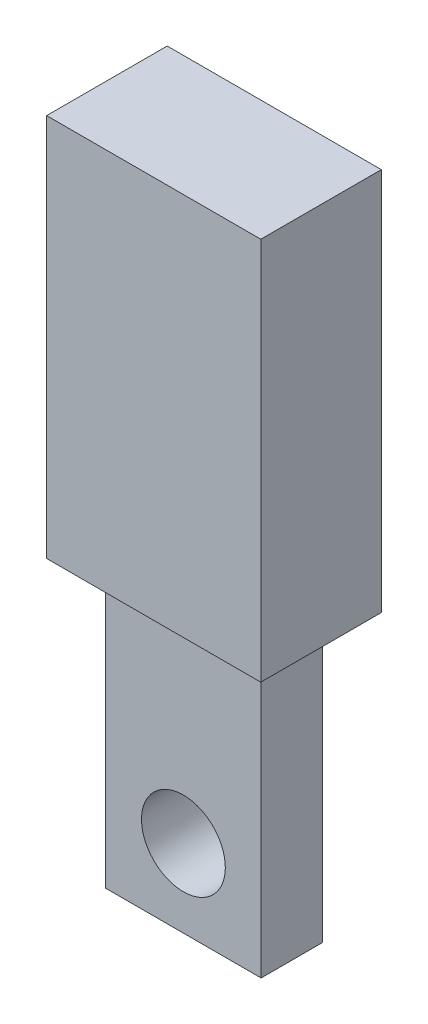
ISO-10303-21;
HEADER;
FILE_DESCRIPTION(('STEP AP214'),'2;1');
FILE_NAME('part.step','',(''),(''),'','','');
FILE_SCHEMA(('AUTOMOTIVE_DESIGN { 1 0 10303 214 1 1 1 1 }'));
ENDSEC;
DATA;
#1=APPLICATION_CONTEXT('core data for automotive mechanical design processes');
#2=APPLICATION_PROTOCOL_DEFINITION('international standard','automotive_design',2000,#1);
#3=PRODUCT_CONTEXT('',#1,'mechanical');
#4=PRODUCT('Part','Part','',(#3));
#5=PRODUCT_RELATED_PRODUCT_CATEGORY('part','',(#4));
#6=PRODUCT_DEFINITION_FORMATION('','',#4);
#7=PRODUCT_DEFINITION_CONTEXT('part definition',#1,'design');
#8=PRODUCT_DEFINITION('design','',#6,#7);
#9=PRODUCT_DEFINITION_SHAPE('','',#8);
#10=(LENGTH_UNIT() NAMED_UNIT(*) SI_UNIT(.MILLI.,.METRE.));
#11=(NAMED_UNIT(*) PLANE_ANGLE_UNIT() SI_UNIT($,.RADIAN.));
#12=(NAMED_UNIT(*) SI_UNIT($,.STERADIAN.) SOLID_ANGLE_UNIT());
#13=UNCERTAINTY_MEASURE_WITH_UNIT(LENGTH_MEASURE(1.E-05),#10,'distance_accuracy_value','');
#14=(GEOMETRIC_REPRESENTATION_CONTEXT(3) GLOBAL_UNCERTAINTY_ASSIGNED_CONTEXT((#13)) GLOBAL_UNIT_ASSIGNED_CONTEXT((#10,
#11,#12)) REPRESENTATION_CONTEXT('',''));
#15=CARTESIAN_POINT('',(0.,0.,0.));
#16=DIRECTION('',(0.,0.,1.));
#17=DIRECTION('',(1.,0.,0.));
#18=AXIS2_PLACEMENT_3D('',#15,#16,#17);
#19=CARTESIAN_POINT('',(-32.258,-59.309,-12.7));
#20=DIRECTION('',(-1.,0.,0.));
#21=DIRECTION('',(0.,0.,1.));
#22=AXIS2_PLACEMENT_3D('',#19,#20,#21);
#23=PLANE('',#22);
#24=DIRECTION('',(0.,1.,0.));
#25=VECTOR('',#24,1.);
#26=CARTESIAN_POINT('',(-32.258,-59.309,12.7));
#27=LINE('',#26,#25);
#28=CARTESIAN_POINT('',(-32.258,-59.309,12.7));
#29=VERTEX_POINT('',#28);
#30=CARTESIAN_POINT('',(-32.258,59.309,12.7));
#31=VERTEX_POINT('',#30);
#32=EDGE_CURVE('E33',#29,#31,#27,.T.);
#33=ORIENTED_EDGE('',*,*,#32,.T.);
#34=DIRECTION('',(0.,0.,1.));
#35=VECTOR('',#34,1.);
#36=CARTESIAN_POINT('',(-32.258,59.309,-12.7));
#37=LINE('',#36,#35);
#38=CARTESIAN_POINT('',(-32.258,59.309,-12.7));
#39=VERTEX_POINT('',#38);
#40=EDGE_CURVE('E131',#39,#31,#37,.T.);
#41=ORIENTED_EDGE('',*,*,#40,.F.);
#42=DIRECTION('',(0.,1.,0.));
#43=VECTOR('',#42,1.);
#44=CARTESIAN_POINT('',(-32.258,-59.309,-12.7));
#45=LINE('',#44,#43);
#46=CARTESIAN_POINT('',(-32.258,-59.309,-12.7));
#47=VERTEX_POINT('',#46);
#48=EDGE_CURVE('E11',#47,#39,#45,.T.);
#49=ORIENTED_EDGE('',*,*,#48,.F.);
#50=DIRECTION('',(0.,0.,1.));
#51=VECTOR('',#50,1.);
#52=CARTESIAN_POINT('',(-32.258,-59.309,-12.7));
#53=LINE('',#52,#51);
#54=EDGE_CURVE('E143',#47,#29,#53,.T.);
#55=ORIENTED_EDGE('',*,*,#54,.T.);
#56=EDGE_LOOP('',(#33,#41,#49,#55));
#57=FACE_BOUND('',#56,.T.);
#58=ADVANCED_FACE('F30',(#57),#23,.T.);
#59=CARTESIAN_POINT('',(-32.258,-59.309,-12.7));
#60=DIRECTION('',(0.,0.,-1.));
#61=DIRECTION('',(-1.,0.,0.));
#62=AXIS2_PLACEMENT_3D('',#59,#60,#61);
#63=PLANE('',#62);
#64=CARTESIAN_POINT('',(0.,-27.051,-12.7));
#65=DIRECTION('',(0.,0.,1.));
#66=DIRECTION('',(1.,0.,0.));
#67=AXIS2_PLACEMENT_3D('',#64,#65,#66);
#68=CIRCLE('',#67,17.399);
#69=CARTESIAN_POINT('',(17.399,-27.051,-12.7));
#70=VERTEX_POINT('',#69);
#71=EDGE_CURVE('E123',#70,#70,#68,.T.);
#72=ORIENTED_EDGE('',*,*,#71,.T.);
#73=EDGE_LOOP('',(#72));
#74=FACE_BOUND('',#73,.T.);
#75=ORIENTED_EDGE('',*,*,#48,.T.);
#76=DIRECTION('',(-1.,0.,0.));
#77=VECTOR('',#76,1.);
#78=CARTESIAN_POINT('',(-32.258,59.309,-12.7));
#79=LINE('',#78,#77);
#80=CARTESIAN_POINT('',(32.258,59.309,-12.7));
#81=VERTEX_POINT('',#80);
#82=EDGE_CURVE('E140',#81,#39,#79,.T.);
#83=ORIENTED_EDGE('',*,*,#82,.F.);
#84=DIRECTION('',(0.,1.,0.));
#85=VECTOR('',#84,1.);
#86=CARTESIAN_POINT('',(32.258,-59.309,-12.7));
#87=LINE('',#86,#85);
#88=CARTESIAN_POINT('',(32.258,-59.309,-12.7));
#89=VERTEX_POINT('',#88);
#90=EDGE_CURVE('E38',#89,#81,#87,.T.);
#91=ORIENTED_EDGE('',*,*,#90,.F.);
#92=DIRECTION('',(-1.,0.,0.));
#93=VECTOR('',#92,1.);
#94=CARTESIAN_POINT('',(-32.258,-59.309,-12.7));
#95=LINE('',#94,#93);
#96=EDGE_CURVE('E150',#89,#47,#95,.T.);
#97=ORIENTED_EDGE('',*,*,#96,.T.);
#98=EDGE_LOOP('',(#75,#83,#91,#97));
#99=FACE_BOUND('',#98,.T.);
#100=ADVANCED_FACE('F161',(#74,#99),#63,.T.);
#101=CARTESIAN_POINT('',(32.258,-59.309,-12.7));
#102=DIRECTION('',(1.,0.,0.));
#103=DIRECTION('',(0.,0.,-1.));
#104=AXIS2_PLACEMENT_3D('',#101,#102,#103);
#105=PLANE('',#104);
#106=ORIENTED_EDGE('',*,*,#90,.T.);
#107=DIRECTION('',(0.,0.,-1.));
#108=VECTOR('',#107,1.);
#109=CARTESIAN_POINT('',(32.258,59.309,-12.7));
#110=LINE('',#109,#108);
#111=CARTESIAN_POINT('',(32.258,59.309,12.7));
#112=VERTEX_POINT('',#111);
#113=EDGE_CURVE('E137',#112,#81,#110,.T.);
#114=ORIENTED_EDGE('',*,*,#113,.F.);
#115=DIRECTION('',(0.,1.,0.));
#116=VECTOR('',#115,1.);
#117=CARTESIAN_POINT('',(32.258,-59.309,12.7));
#118=LINE('',#117,#116);
#119=CARTESIAN_POINT('',(32.258,-59.309,12.7));
#120=VERTEX_POINT('',#119);
#121=EDGE_CURVE('E152',#120,#112,#118,.T.);
#122=ORIENTED_EDGE('',*,*,#121,.F.);
#123=DIRECTION('',(0.,0.,-1.));
#124=VECTOR('',#123,1.);
#125=CARTESIAN_POINT('',(32.258,-59.309,-12.7));
#126=LINE('',#125,#124);
#127=EDGE_CURVE('E148',#120,#89,#126,.T.);
#128=ORIENTED_EDGE('',*,*,#127,.T.);
#129=EDGE_LOOP('',(#106,#114,#122,#128));
#130=FACE_BOUND('',#129,.T.);
#131=ADVANCED_FACE('F167',(#130),#105,.T.);
#132=CARTESIAN_POINT('',(-32.258,-59.309,12.7));
#133=DIRECTION('',(0.,0.,1.));
#134=DIRECTION('',(1.,0.,0.));
#135=AXIS2_PLACEMENT_3D('',#132,#133,#134);
#136=PLANE('',#135);
#137=CARTESIAN_POINT('',(0.,-27.051,12.7));
#138=DIRECTION('',(0.,0.,1.));
#139=DIRECTION('',(1.,0.,0.));
#140=AXIS2_PLACEMENT_3D('',#137,#138,#139);
#141=CIRCLE('',#140,17.399);
#142=CARTESIAN_POINT('',(17.399,-27.051,12.7));
#143=VERTEX_POINT('',#142);
#144=EDGE_CURVE('E120',#143,#143,#141,.T.);
#145=ORIENTED_EDGE('',*,*,#144,.F.);
#146=EDGE_LOOP('',(#145));
#147=FACE_BOUND('',#146,.T.);
#148=ORIENTED_EDGE('',*,*,#121,.T.);
#149=DIRECTION('',(1.,0.,0.));
#150=VECTOR('',#149,1.);
#151=CARTESIAN_POINT('',(-32.258,59.309,12.7));
#152=LINE('',#151,#150);
#153=EDGE_CURVE('E134',#31,#112,#152,.T.);
#154=ORIENTED_EDGE('',*,*,#153,.F.);
#155=ORIENTED_EDGE('',*,*,#32,.F.);
#156=DIRECTION('',(1.,0.,0.));
#157=VECTOR('',#156,1.);
#158=CARTESIAN_POINT('',(-32.258,-59.309,12.7));
#159=LINE('',#158,#157);
#160=EDGE_CURVE('E145',#29,#120,#159,.T.);
#161=ORIENTED_EDGE('',*,*,#160,.T.);
#162=EDGE_LOOP('',(#148,#154,#155,#161));
#163=FACE_BOUND('',#162,.T.);
#164=ADVANCED_FACE('F157',(#147,#163),#136,.T.);
#165=CARTESIAN_POINT('',(-32.258,-59.309,12.7));
#166=DIRECTION('',(0.,1.,0.));
#167=DIRECTION('',(0.,0.,1.));
#168=AXIS2_PLACEMENT_3D('',#165,#166,#167);
#169=PLANE('',#168);
#170=ORIENTED_EDGE('',*,*,#54,.F.);
#171=ORIENTED_EDGE('',*,*,#96,.F.);
#172=ORIENTED_EDGE('',*,*,#127,.F.);
#173=ORIENTED_EDGE('',*,*,#160,.F.);
#174=EDGE_LOOP('',(#170,#171,#172,#173));
#175=FACE_BOUND('',#174,.T.);
#176=ADVANCED_FACE('F165',(#175),#169,.F.);
#177=CARTESIAN_POINT('',(0.,-27.051,-12.7));
#178=DIRECTION('',(0.,0.,1.));
#179=DIRECTION('',(1.,0.,0.));
#180=AXIS2_PLACEMENT_3D('',#177,#178,#179);
#181=CYLINDRICAL_SURFACE('',#180,17.399);
#182=ORIENTED_EDGE('',*,*,#71,.F.);
#183=EDGE_LOOP('',(#182));
#184=FACE_BOUND('',#183,.T.);
#185=ORIENTED_EDGE('',*,*,#144,.T.);
#186=EDGE_LOOP('',(#185));
#187=FACE_BOUND('',#186,.T.);
#188=ADVANCED_FACE('F206',(#184,#187),#181,.F.);
#189=CARTESIAN_POINT('',(44.45,218.567,25.019));
#190=DIRECTION('',(-1.,0.,0.));
#191=DIRECTION('',(0.,0.,1.));
#192=AXIS2_PLACEMENT_3D('',#189,#190,#191);
#193=PLANE('',#192);
#194=DIRECTION('',(0.,0.,-1.));
#195=VECTOR('',#194,1.);
#196=CARTESIAN_POINT('',(44.45,59.309,25.019));
#197=LINE('',#196,#195);
#198=CARTESIAN_POINT('',(44.45,59.309,25.019));
#199=VERTEX_POINT('',#198);
#200=CARTESIAN_POINT('',(44.45,59.309,-25.019));
#201=VERTEX_POINT('',#200);
#202=EDGE_CURVE('E119',#199,#201,#197,.T.);
#203=ORIENTED_EDGE('',*,*,#202,.T.);
#204=DIRECTION('',(0.,-1.,0.));
#205=VECTOR('',#204,1.);
#206=CARTESIAN_POINT('',(44.45,218.567,-25.019));
#207=LINE('',#206,#205);
#208=CARTESIAN_POINT('',(44.45,218.567,-25.019));
#209=VERTEX_POINT('',#208);
#210=EDGE_CURVE('E99',#209,#201,#207,.T.);
#211=ORIENTED_EDGE('',*,*,#210,.F.);
#212=DIRECTION('',(0.,0.,-1.));
#213=VECTOR('',#212,1.);
#214=CARTESIAN_POINT('',(44.45,218.567,25.019));
#215=LINE('',#214,#213);
#216=CARTESIAN_POINT('',(44.45,218.567,25.019));
#217=VERTEX_POINT('',#216);
#218=EDGE_CURVE('E106',#217,#209,#215,.T.);
#219=ORIENTED_EDGE('',*,*,#218,.F.);
#220=DIRECTION('',(0.,-1.,0.));
#221=VECTOR('',#220,1.);
#222=CARTESIAN_POINT('',(44.45,218.567,25.019));
#223=LINE('',#222,#221);
#224=EDGE_CURVE('E273',#217,#199,#223,.T.);
#225=ORIENTED_EDGE('',*,*,#224,.T.);
#226=EDGE_LOOP('',(#203,#211,#219,#225));
#227=FACE_BOUND('',#226,.T.);
#228=ADVANCED_FACE('F117',(#227),#193,.F.);
#229=CARTESIAN_POINT('',(44.45,218.567,-25.019));
#230=DIRECTION('',(0.,0.,1.));
#231=DIRECTION('',(1.,0.,0.));
#232=AXIS2_PLACEMENT_3D('',#229,#230,#231);
#233=PLANE('',#232);
#234=DIRECTION('',(-1.,0.,0.));
#235=VECTOR('',#234,1.);
#236=CARTESIAN_POINT('',(44.45,59.309,-25.019));
#237=LINE('',#236,#235);
#238=CARTESIAN_POINT('',(-44.45,59.309,-25.019));
#239=VERTEX_POINT('',#238);
#240=EDGE_CURVE('E279',#201,#239,#237,.T.);
#241=ORIENTED_EDGE('',*,*,#240,.T.);
#242=DIRECTION('',(0.,-1.,0.));
#243=VECTOR('',#242,1.);
#244=CARTESIAN_POINT('',(-44.45,218.567,-25.019));
#245=LINE('',#244,#243);
#246=CARTESIAN_POINT('',(-44.45,218.567,-25.019));
#247=VERTEX_POINT('',#246);
#248=EDGE_CURVE('E102',#247,#239,#245,.T.);
#249=ORIENTED_EDGE('',*,*,#248,.F.);
#250=DIRECTION('',(-1.,0.,0.));
#251=VECTOR('',#250,1.);
#252=CARTESIAN_POINT('',(44.45,218.567,-25.019));
#253=LINE('',#252,#251);
#254=EDGE_CURVE('E95',#209,#247,#253,.T.);
#255=ORIENTED_EDGE('',*,*,#254,.F.);
#256=ORIENTED_EDGE('',*,*,#210,.T.);
#257=EDGE_LOOP('',(#241,#249,#255,#256));
#258=FACE_BOUND('',#257,.T.);
#259=ADVANCED_FACE('F97',(#258),#233,.F.);
#260=CARTESIAN_POINT('',(-44.45,218.567,25.019));
#261=DIRECTION('',(1.,0.,0.));
#262=DIRECTION('',(0.,0.,-1.));
#263=AXIS2_PLACEMENT_3D('',#260,#261,#262);
#264=PLANE('',#263);
#265=DIRECTION('',(0.,0.,1.));
#266=VECTOR('',#265,1.);
#267=CARTESIAN_POINT('',(-44.45,59.309,25.019));
#268=LINE('',#267,#266);
#269=CARTESIAN_POINT('',(-44.45,59.309,25.019));
#270=VERTEX_POINT('',#269);
#271=EDGE_CURVE('E276',#239,#270,#268,.T.);
#272=ORIENTED_EDGE('',*,*,#271,.T.);
#273=DIRECTION('',(0.,-1.,0.));
#274=VECTOR('',#273,1.);
#275=CARTESIAN_POINT('',(-44.45,218.567,25.019));
#276=LINE('',#275,#274);
#277=CARTESIAN_POINT('',(-44.45,218.567,25.019));
#278=VERTEX_POINT('',#277);
#279=EDGE_CURVE('E125',#278,#270,#276,.T.);
#280=ORIENTED_EDGE('',*,*,#279,.F.);
#281=DIRECTION('',(0.,0.,1.));
#282=VECTOR('',#281,1.);
#283=CARTESIAN_POINT('',(-44.45,218.567,25.019));
#284=LINE('',#283,#282);
#285=EDGE_CURVE('E105',#247,#278,#284,.T.);
#286=ORIENTED_EDGE('',*,*,#285,.F.);
#287=ORIENTED_EDGE('',*,*,#248,.T.);
#288=EDGE_LOOP('',(#272,#280,#286,#287));
#289=FACE_BOUND('',#288,.T.);
#290=ADVANCED_FACE('F217',(#289),#264,.F.);
#291=CARTESIAN_POINT('',(44.45,218.567,25.019));
#292=DIRECTION('',(0.,0.,-1.));
#293=DIRECTION('',(-1.,0.,0.));
#294=AXIS2_PLACEMENT_3D('',#291,#292,#293);
#295=PLANE('',#294);
#296=DIRECTION('',(1.,0.,0.));
#297=VECTOR('',#296,1.);
#298=CARTESIAN_POINT('',(44.45,59.309,25.019));
#299=LINE('',#298,#297);
#300=EDGE_CURVE('E115',#270,#199,#299,.T.);
#301=ORIENTED_EDGE('',*,*,#300,.T.);
#302=ORIENTED_EDGE('',*,*,#224,.F.);
#303=DIRECTION('',(1.,0.,0.));
#304=VECTOR('',#303,1.);
#305=CARTESIAN_POINT('',(44.45,218.567,25.019));
#306=LINE('',#305,#304);
#307=EDGE_CURVE('E111',#278,#217,#306,.T.);
#308=ORIENTED_EDGE('',*,*,#307,.F.);
#309=ORIENTED_EDGE('',*,*,#279,.T.);
#310=EDGE_LOOP('',(#301,#302,#308,#309));
#311=FACE_BOUND('',#310,.T.);
#312=ADVANCED_FACE('F226',(#311),#295,.F.);
#313=CARTESIAN_POINT('',(44.45,218.567,-25.019));
#314=DIRECTION('',(0.,1.,0.));
#315=DIRECTION('',(0.,0.,1.));
#316=AXIS2_PLACEMENT_3D('',#313,#314,#315);
#317=PLANE('',#316);
#318=ORIENTED_EDGE('',*,*,#218,.T.);
#319=ORIENTED_EDGE('',*,*,#254,.T.);
#320=ORIENTED_EDGE('',*,*,#285,.T.);
#321=ORIENTED_EDGE('',*,*,#307,.T.);
#322=EDGE_LOOP('',(#318,#319,#320,#321));
#323=FACE_BOUND('',#322,.T.);
#324=ADVANCED_FACE('F109',(#323),#317,.T.);
#325=CARTESIAN_POINT('',(44.45,59.309,-25.019));
#326=DIRECTION('',(0.,1.,0.));
#327=DIRECTION('',(0.,0.,1.));
#328=AXIS2_PLACEMENT_3D('',#325,#326,#327);
#329=PLANE('',#328);
#330=ORIENTED_EDGE('',*,*,#40,.T.);
#331=ORIENTED_EDGE('',*,*,#153,.T.);
#332=ORIENTED_EDGE('',*,*,#113,.T.);
#333=ORIENTED_EDGE('',*,*,#82,.T.);
#334=EDGE_LOOP('',(#330,#331,#332,#333));
#335=FACE_BOUND('',#334,.T.);
#336=ORIENTED_EDGE('',*,*,#202,.F.);
#337=ORIENTED_EDGE('',*,*,#300,.F.);
#338=ORIENTED_EDGE('',*,*,#271,.F.);
#339=ORIENTED_EDGE('',*,*,#240,.F.);
#340=EDGE_LOOP('',(#336,#337,#338,#339));
#341=FACE_BOUND('',#340,.T.);
#342=ADVANCED_FACE('F159',(#335,#341),#329,.F.);
#343=CLOSED_SHELL('',(#58,#100,#131,#164,#176,#188,#228,#259,#290,#312,#324,#342));
#344=MANIFOLD_SOLID_BREP('B2',#343);
#345=ADVANCED_BREP_SHAPE_REPRESENTATION('',(#18,#344),#14);
#346=SHAPE_DEFINITION_REPRESENTATION(#9,#345);
ENDSEC;
END-ISO-10303-21;
